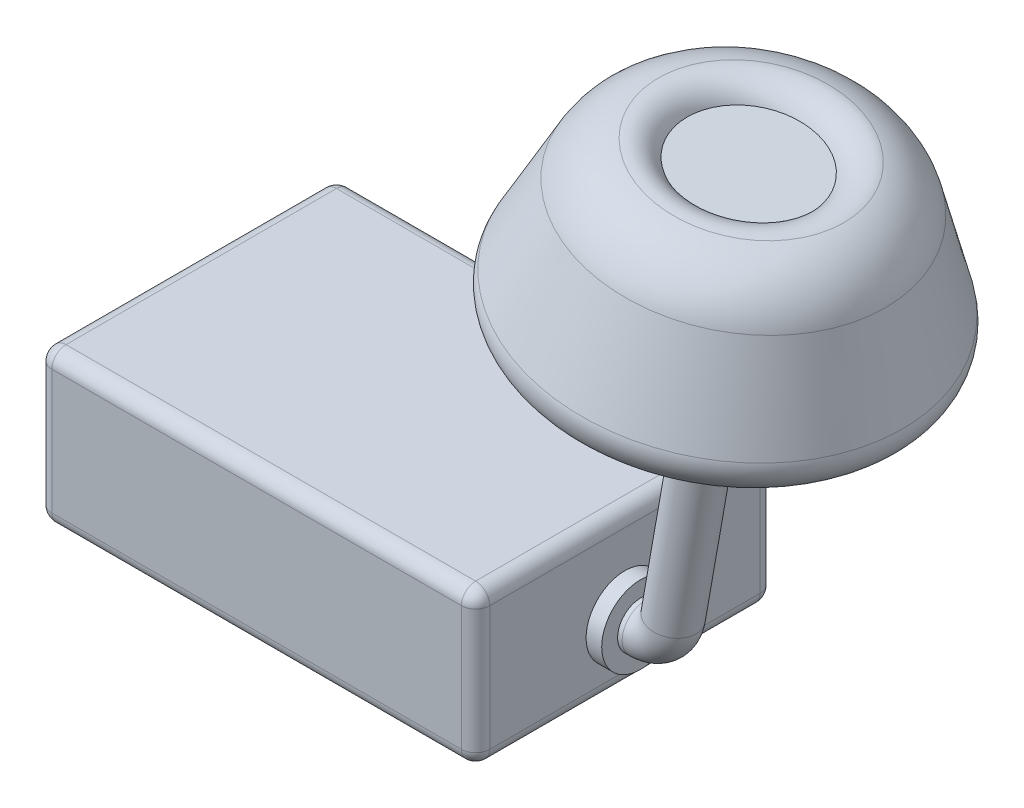
ISO-10303-21;
HEADER;
FILE_DESCRIPTION(('STEP AP214'),'2;1');
FILE_NAME('part.step','',(''),(''),'','','');
FILE_SCHEMA(('AUTOMOTIVE_DESIGN { 1 0 10303 214 1 1 1 1 }'));
ENDSEC;
DATA;
#1=APPLICATION_CONTEXT('core data for automotive mechanical design processes');
#2=APPLICATION_PROTOCOL_DEFINITION('international standard','automotive_design',2000,#1);
#3=PRODUCT_CONTEXT('',#1,'mechanical');
#4=PRODUCT('Part','Part','',(#3));
#5=PRODUCT_RELATED_PRODUCT_CATEGORY('part','',(#4));
#6=PRODUCT_DEFINITION_FORMATION('','',#4);
#7=PRODUCT_DEFINITION_CONTEXT('part definition',#1,'design');
#8=PRODUCT_DEFINITION('design','',#6,#7);
#9=PRODUCT_DEFINITION_SHAPE('','',#8);
#10=(LENGTH_UNIT() NAMED_UNIT(*) SI_UNIT(.MILLI.,.METRE.));
#11=(NAMED_UNIT(*) PLANE_ANGLE_UNIT() SI_UNIT($,.RADIAN.));
#12=(NAMED_UNIT(*) SI_UNIT($,.STERADIAN.) SOLID_ANGLE_UNIT());
#13=UNCERTAINTY_MEASURE_WITH_UNIT(LENGTH_MEASURE(1.E-05),#10,'distance_accuracy_value','');
#14=(GEOMETRIC_REPRESENTATION_CONTEXT(3) GLOBAL_UNCERTAINTY_ASSIGNED_CONTEXT((#13)) GLOBAL_UNIT_ASSIGNED_CONTEXT((#10,
#11,#12)) REPRESENTATION_CONTEXT('',''));
#15=CARTESIAN_POINT('',(0.,0.,0.));
#16=DIRECTION('',(0.,0.,1.));
#17=DIRECTION('',(1.,0.,0.));
#18=AXIS2_PLACEMENT_3D('',#15,#16,#17);
#19=CARTESIAN_POINT('',(19.5834,13.6652,-13.3604));
#20=DIRECTION('',(-1.,0.,0.));
#21=DIRECTION('',(0.,0.,1.));
#22=AXIS2_PLACEMENT_3D('',#19,#20,#21);
#23=PLANE('',#22);
#24=DIRECTION('',(0.,0.,-1.));
#25=VECTOR('',#24,1.);
#26=CARTESIAN_POINT('',(19.5834,1.27,-13.3604));
#27=LINE('',#26,#25);
#28=CARTESIAN_POINT('',(19.5834,1.27,12.0904));
#29=VERTEX_POINT('',#28);
#30=CARTESIAN_POINT('',(19.5834,1.27,-12.0904));
#31=VERTEX_POINT('',#30);
#32=EDGE_CURVE('E209',#29,#31,#27,.T.);
#33=ORIENTED_EDGE('',*,*,#32,.T.);
#34=DIRECTION('',(0.,-1.,0.));
#35=VECTOR('',#34,1.);
#36=CARTESIAN_POINT('',(19.5834,13.6652,-12.0904));
#37=LINE('',#36,#35);
#38=CARTESIAN_POINT('',(19.5834,12.3952,-12.0904));
#39=VERTEX_POINT('',#38);
#40=EDGE_CURVE('E212',#31,#39,#37,.F.);
#41=ORIENTED_EDGE('',*,*,#40,.T.);
#42=DIRECTION('',(0.,0.,-1.));
#43=VECTOR('',#42,1.);
#44=CARTESIAN_POINT('',(19.5834,12.3952,13.3604));
#45=LINE('',#44,#43);
#46=CARTESIAN_POINT('',(19.5834,12.3952,12.0904));
#47=VERTEX_POINT('',#46);
#48=EDGE_CURVE('E207',#39,#47,#45,.F.);
#49=ORIENTED_EDGE('',*,*,#48,.T.);
#50=DIRECTION('',(0.,-1.,0.));
#51=VECTOR('',#50,1.);
#52=CARTESIAN_POINT('',(19.5834,13.6652,12.0904));
#53=LINE('',#52,#51);
#54=EDGE_CURVE('E205',#47,#29,#53,.T.);
#55=ORIENTED_EDGE('',*,*,#54,.T.);
#56=EDGE_LOOP('',(#33,#41,#49,#55));
#57=FACE_BOUND('',#56,.T.);
#58=CARTESIAN_POINT('',(19.5834,5.588,0.));
#59=DIRECTION('',(-1.,0.,0.));
#60=DIRECTION('',(0.,0.,1.));
#61=AXIS2_PLACEMENT_3D('',#58,#59,#60);
#62=CIRCLE('',#61,3.4798);
#63=CARTESIAN_POINT('',(19.5834,5.588,3.4798));
#64=VERTEX_POINT('',#63);
#65=EDGE_CURVE('E312',#64,#64,#62,.F.);
#66=ORIENTED_EDGE('',*,*,#65,.F.);
#67=EDGE_LOOP('',(#66));
#68=FACE_BOUND('',#67,.T.);
#69=ADVANCED_FACE('F38',(#57,#68),#23,.F.);
#70=CARTESIAN_POINT('',(-19.5834,13.6652,-13.3604));
#71=DIRECTION('',(1.,0.,0.));
#72=DIRECTION('',(0.,0.,-1.));
#73=AXIS2_PLACEMENT_3D('',#70,#71,#72);
#74=PLANE('',#73);
#75=DIRECTION('',(0.,0.,1.));
#76=VECTOR('',#75,1.);
#77=CARTESIAN_POINT('',(-19.5834,12.3952,-13.3604));
#78=LINE('',#77,#76);
#79=CARTESIAN_POINT('',(-19.5834,12.3952,12.0904));
#80=VERTEX_POINT('',#79);
#81=CARTESIAN_POINT('',(-19.5834,12.3952,-12.0904));
#82=VERTEX_POINT('',#81);
#83=EDGE_CURVE('E168',#80,#82,#78,.F.);
#84=ORIENTED_EDGE('',*,*,#83,.T.);
#85=DIRECTION('',(0.,-1.,0.));
#86=VECTOR('',#85,1.);
#87=CARTESIAN_POINT('',(-19.5834,13.6652,-12.0904));
#88=LINE('',#87,#86);
#89=CARTESIAN_POINT('',(-19.5834,1.27,-12.0904));
#90=VERTEX_POINT('',#89);
#91=EDGE_CURVE('E173',#82,#90,#88,.T.);
#92=ORIENTED_EDGE('',*,*,#91,.T.);
#93=DIRECTION('',(0.,0.,1.));
#94=VECTOR('',#93,1.);
#95=CARTESIAN_POINT('',(-19.5834,1.27,-13.3604));
#96=LINE('',#95,#94);
#97=CARTESIAN_POINT('',(-19.5834,1.27,12.0904));
#98=VERTEX_POINT('',#97);
#99=EDGE_CURVE('E141',#90,#98,#96,.T.);
#100=ORIENTED_EDGE('',*,*,#99,.T.);
#101=DIRECTION('',(0.,-1.,0.));
#102=VECTOR('',#101,1.);
#103=CARTESIAN_POINT('',(-19.5834,13.6652,12.0904));
#104=LINE('',#103,#102);
#105=EDGE_CURVE('E161',#98,#80,#104,.F.);
#106=ORIENTED_EDGE('',*,*,#105,.T.);
#107=EDGE_LOOP('',(#84,#92,#100,#106));
#108=FACE_BOUND('',#107,.T.);
#109=ADVANCED_FACE('F171',(#108),#74,.F.);
#110=CARTESIAN_POINT('',(-19.5834,13.6652,13.3604));
#111=DIRECTION('',(0.,0.,-1.));
#112=DIRECTION('',(-1.,0.,0.));
#113=AXIS2_PLACEMENT_3D('',#110,#111,#112);
#114=PLANE('',#113);
#115=DIRECTION('',(0.,-1.,0.));
#116=VECTOR('',#115,1.);
#117=CARTESIAN_POINT('',(-18.3134,13.6652,13.3604));
#118=LINE('',#117,#116);
#119=CARTESIAN_POINT('',(-18.3134,12.3952,13.3604));
#120=VERTEX_POINT('',#119);
#121=CARTESIAN_POINT('',(-18.3134,1.27,13.3604));
#122=VERTEX_POINT('',#121);
#123=EDGE_CURVE('E196',#120,#122,#118,.T.);
#124=ORIENTED_EDGE('',*,*,#123,.T.);
#125=DIRECTION('',(1.,0.,0.));
#126=VECTOR('',#125,1.);
#127=CARTESIAN_POINT('',(-19.5834,1.27,13.3604));
#128=LINE('',#127,#126);
#129=CARTESIAN_POINT('',(18.3134,1.27,13.3604));
#130=VERTEX_POINT('',#129);
#131=EDGE_CURVE('E201',#122,#130,#128,.T.);
#132=ORIENTED_EDGE('',*,*,#131,.T.);
#133=DIRECTION('',(0.,-1.,0.));
#134=VECTOR('',#133,1.);
#135=CARTESIAN_POINT('',(18.3134,13.6652,13.3604));
#136=LINE('',#135,#134);
#137=CARTESIAN_POINT('',(18.3134,12.3952,13.3604));
#138=VERTEX_POINT('',#137);
#139=EDGE_CURVE('E199',#130,#138,#136,.F.);
#140=ORIENTED_EDGE('',*,*,#139,.T.);
#141=DIRECTION('',(1.,0.,0.));
#142=VECTOR('',#141,1.);
#143=CARTESIAN_POINT('',(-19.5834,12.3952,13.3604));
#144=LINE('',#143,#142);
#145=EDGE_CURVE('E193',#138,#120,#144,.F.);
#146=ORIENTED_EDGE('',*,*,#145,.T.);
#147=EDGE_LOOP('',(#124,#132,#140,#146));
#148=FACE_BOUND('',#147,.T.);
#149=ADVANCED_FACE('F362',(#148),#114,.F.);
#150=CARTESIAN_POINT('',(-19.5834,13.6652,-13.3604));
#151=DIRECTION('',(0.,0.,1.));
#152=DIRECTION('',(1.,0.,0.));
#153=AXIS2_PLACEMENT_3D('',#150,#151,#152);
#154=PLANE('',#153);
#155=DIRECTION('',(-1.,0.,0.));
#156=VECTOR('',#155,1.);
#157=CARTESIAN_POINT('',(-19.5834,1.27,-13.3604));
#158=LINE('',#157,#156);
#159=CARTESIAN_POINT('',(18.3134,1.27,-13.3604));
#160=VERTEX_POINT('',#159);
#161=CARTESIAN_POINT('',(-18.3134,1.27,-13.3604));
#162=VERTEX_POINT('',#161);
#163=EDGE_CURVE('E218',#160,#162,#158,.T.);
#164=ORIENTED_EDGE('',*,*,#163,.T.);
#165=DIRECTION('',(0.,-1.,0.));
#166=VECTOR('',#165,1.);
#167=CARTESIAN_POINT('',(-18.3134,13.6652,-13.3604));
#168=LINE('',#167,#166);
#169=CARTESIAN_POINT('',(-18.3134,12.3952,-13.3604));
#170=VERTEX_POINT('',#169);
#171=EDGE_CURVE('E222',#162,#170,#168,.F.);
#172=ORIENTED_EDGE('',*,*,#171,.T.);
#173=DIRECTION('',(-1.,0.,0.));
#174=VECTOR('',#173,1.);
#175=CARTESIAN_POINT('',(19.5834,12.3952,-13.3604));
#176=LINE('',#175,#174);
#177=CARTESIAN_POINT('',(18.3134,12.3952,-13.3604));
#178=VERTEX_POINT('',#177);
#179=EDGE_CURVE('E216',#170,#178,#176,.F.);
#180=ORIENTED_EDGE('',*,*,#179,.T.);
#181=DIRECTION('',(0.,-1.,0.));
#182=VECTOR('',#181,1.);
#183=CARTESIAN_POINT('',(18.3134,13.6652,-13.3604));
#184=LINE('',#183,#182);
#185=EDGE_CURVE('E214',#178,#160,#184,.T.);
#186=ORIENTED_EDGE('',*,*,#185,.T.);
#187=EDGE_LOOP('',(#164,#172,#180,#186));
#188=FACE_BOUND('',#187,.T.);
#189=ADVANCED_FACE('F367',(#188),#154,.F.);
#190=CARTESIAN_POINT('',(0.,13.6652,0.));
#191=DIRECTION('',(0.,1.,0.));
#192=DIRECTION('',(0.,0.,1.));
#193=AXIS2_PLACEMENT_3D('',#190,#191,#192);
#194=PLANE('',#193);
#195=DIRECTION('',(0.,0.,-1.));
#196=VECTOR('',#195,1.);
#197=CARTESIAN_POINT('',(18.3134,13.6652,-13.3604));
#198=LINE('',#197,#196);
#199=CARTESIAN_POINT('',(18.3134,13.6652,12.0904));
#200=VERTEX_POINT('',#199);
#201=CARTESIAN_POINT('',(18.3134,13.6652,-12.0904));
#202=VERTEX_POINT('',#201);
#203=EDGE_CURVE('E58',#200,#202,#198,.T.);
#204=ORIENTED_EDGE('',*,*,#203,.T.);
#205=DIRECTION('',(-1.,0.,0.));
#206=VECTOR('',#205,1.);
#207=CARTESIAN_POINT('',(-19.5834,13.6652,-12.0904));
#208=LINE('',#207,#206);
#209=CARTESIAN_POINT('',(-18.3134,13.6652,-12.0904));
#210=VERTEX_POINT('',#209);
#211=EDGE_CURVE('E11',#202,#210,#208,.T.);
#212=ORIENTED_EDGE('',*,*,#211,.T.);
#213=DIRECTION('',(0.,0.,1.));
#214=VECTOR('',#213,1.);
#215=CARTESIAN_POINT('',(-18.3134,13.6652,13.3604));
#216=LINE('',#215,#214);
#217=CARTESIAN_POINT('',(-18.3134,13.6652,12.0904));
#218=VERTEX_POINT('',#217);
#219=EDGE_CURVE('E47',#210,#218,#216,.T.);
#220=ORIENTED_EDGE('',*,*,#219,.T.);
#221=DIRECTION('',(1.,0.,0.));
#222=VECTOR('',#221,1.);
#223=CARTESIAN_POINT('',(19.5834,13.6652,12.0904));
#224=LINE('',#223,#222);
#225=EDGE_CURVE('E224',#218,#200,#224,.T.);
#226=ORIENTED_EDGE('',*,*,#225,.T.);
#227=EDGE_LOOP('',(#204,#212,#220,#226));
#228=FACE_BOUND('',#227,.T.);
#229=ADVANCED_FACE('F426',(#228),#194,.T.);
#230=CARTESIAN_POINT('',(0.,0.,0.));
#231=DIRECTION('',(0.,1.,0.));
#232=DIRECTION('',(0.,0.,1.));
#233=AXIS2_PLACEMENT_3D('',#230,#231,#232);
#234=PLANE('',#233);
#235=DIRECTION('',(1.,0.,0.));
#236=VECTOR('',#235,1.);
#237=CARTESIAN_POINT('',(0.,0.,12.0904));
#238=LINE('',#237,#236);
#239=CARTESIAN_POINT('',(18.3134,0.,12.0904));
#240=VERTEX_POINT('',#239);
#241=CARTESIAN_POINT('',(-18.3134,0.,12.0904));
#242=VERTEX_POINT('',#241);
#243=EDGE_CURVE('E188',#240,#242,#238,.F.);
#244=ORIENTED_EDGE('',*,*,#243,.T.);
#245=DIRECTION('',(0.,0.,1.));
#246=VECTOR('',#245,1.);
#247=CARTESIAN_POINT('',(-18.3134,0.,0.));
#248=LINE('',#247,#246);
#249=CARTESIAN_POINT('',(-18.3134,0.,-12.0904));
#250=VERTEX_POINT('',#249);
#251=EDGE_CURVE('E143',#242,#250,#248,.F.);
#252=ORIENTED_EDGE('',*,*,#251,.T.);
#253=DIRECTION('',(-1.,0.,0.));
#254=VECTOR('',#253,1.);
#255=CARTESIAN_POINT('',(0.,0.,-12.0904));
#256=LINE('',#255,#254);
#257=CARTESIAN_POINT('',(18.3134,0.,-12.0904));
#258=VERTEX_POINT('',#257);
#259=EDGE_CURVE('E179',#250,#258,#256,.F.);
#260=ORIENTED_EDGE('',*,*,#259,.T.);
#261=DIRECTION('',(0.,0.,-1.));
#262=VECTOR('',#261,1.);
#263=CARTESIAN_POINT('',(18.3134,0.,0.));
#264=LINE('',#263,#262);
#265=EDGE_CURVE('E186',#258,#240,#264,.F.);
#266=ORIENTED_EDGE('',*,*,#265,.T.);
#267=EDGE_LOOP('',(#244,#252,#260,#266));
#268=FACE_BOUND('',#267,.T.);
#269=ADVANCED_FACE('F424',(#268),#234,.F.);
#270=CARTESIAN_POINT('',(20.9804,5.588,0.));
#271=DIRECTION('',(-1.,0.,0.));
#272=DIRECTION('',(0.,0.,1.));
#273=AXIS2_PLACEMENT_3D('',#270,#271,#272);
#274=CYLINDRICAL_SURFACE('',#273,3.4798);
#275=CARTESIAN_POINT('',(20.9804,5.588,0.));
#276=DIRECTION('',(1.,0.,0.));
#277=DIRECTION('',(0.,0.,-1.));
#278=AXIS2_PLACEMENT_3D('',#275,#276,#277);
#279=CIRCLE('',#278,3.4798);
#280=CARTESIAN_POINT('',(20.9804,5.588,-3.4798));
#281=VERTEX_POINT('',#280);
#282=EDGE_CURVE('E318',#281,#281,#279,.T.);
#283=ORIENTED_EDGE('',*,*,#282,.F.);
#284=EDGE_LOOP('',(#283));
#285=FACE_BOUND('',#284,.T.);
#286=ORIENTED_EDGE('',*,*,#65,.T.);
#287=EDGE_LOOP('',(#286));
#288=FACE_BOUND('',#287,.T.);
#289=ADVANCED_FACE('F420',(#285,#288),#274,.T.);
#290=CARTESIAN_POINT('',(20.9804,5.588,0.));
#291=DIRECTION('',(1.,0.,0.));
#292=DIRECTION('',(0.,0.,-1.));
#293=AXIS2_PLACEMENT_3D('',#290,#291,#292);
#294=PLANE('',#293);
#295=CARTESIAN_POINT('',(20.9804,5.588,0.));
#296=DIRECTION('',(1.,0.,0.));
#297=DIRECTION('',(0.,0.,-1.));
#298=AXIS2_PLACEMENT_3D('',#295,#296,#297);
#299=CIRCLE('',#298,2.0574);
#300=CARTESIAN_POINT('',(20.9804,3.5306,0.));
#301=VERTEX_POINT('',#300);
#302=EDGE_CURVE('E308',#301,#301,#299,.T.);
#303=ORIENTED_EDGE('',*,*,#302,.F.);
#304=EDGE_LOOP('',(#303));
#305=FACE_BOUND('',#304,.T.);
#306=ORIENTED_EDGE('',*,*,#282,.T.);
#307=EDGE_LOOP('',(#306));
#308=FACE_BOUND('',#307,.T.);
#309=ADVANCED_FACE('F416',(#305,#308),#294,.T.);
#310=CARTESIAN_POINT('',(23.8904986294607,7.686933628726,0.));
#311=DIRECTION('',(0.173648177666927,0.984807753012209,0.));
#312=DIRECTION('',(-0.984807753012209,0.173648177666927,0.));
#313=AXIS2_PLACEMENT_3D('',#310,#311,#312);
#314=CYLINDRICAL_SURFACE('',#313,2.0574);
#315=CARTESIAN_POINT('',(23.8904986294607,7.686933628726,0.));
#316=DIRECTION('',(0.173648177666928,0.984807753012208,0.));
#317=DIRECTION('',(0.,0.,-1.));
#318=AXIS2_PLACEMENT_3D('',#315,#316,#317);
#319=CIRCLE('',#318,2.0574);
#320=CARTESIAN_POINT('',(25.916642100508,7.32966986799406,0.));
#321=VERTEX_POINT('',#320);
#322=EDGE_CURVE('E307',#321,#321,#319,.T.);
#323=ORIENTED_EDGE('',*,*,#322,.T.);
#324=EDGE_LOOP('',(#323));
#325=FACE_BOUND('',#324,.T.);
#326=CARTESIAN_POINT('',(26.607864598918,23.0978818485571,0.));
#327=DIRECTION('',(0.173648177666928,0.984807753012208,0.));
#328=DIRECTION('',(0.,0.,-1.));
#329=AXIS2_PLACEMENT_3D('',#326,#327,#328);
#330=CIRCLE('',#329,2.0574);
#331=CARTESIAN_POINT('',(26.607864598918,23.0978818485571,-2.0574));
#332=VERTEX_POINT('',#331);
#333=EDGE_CURVE('E315',#332,#332,#330,.T.);
#334=ORIENTED_EDGE('',*,*,#333,.F.);
#335=EDGE_LOOP('',(#334));
#336=FACE_BOUND('',#335,.T.);
#337=ADVANCED_FACE('F412',(#325,#336),#314,.T.);
#338=CARTESIAN_POINT('',(21.3890869368097,8.128,0.));
#339=DIRECTION('',(0.,0.,1.));
#340=DIRECTION('',(1.,0.,0.));
#341=AXIS2_PLACEMENT_3D('',#338,#339,#340);
#342=TOROIDAL_SURFACE('',#341,2.54,2.0574);
#343=CARTESIAN_POINT('',(21.3890869368097,5.588,0.));
#344=DIRECTION('',(1.,0.,0.));
#345=DIRECTION('',(0.,0.,-1.));
#346=AXIS2_PLACEMENT_3D('',#343,#344,#345);
#347=CIRCLE('',#346,2.0574);
#348=CARTESIAN_POINT('',(21.3890869368097,3.5306,0.));
#349=VERTEX_POINT('',#348);
#350=EDGE_CURVE('E302',#349,#349,#347,.T.);
#351=CARTESIAN_POINT('',(21.3890869368097,8.128,0.));
#352=DIRECTION('',(0.,0.,1.));
#353=DIRECTION('',(1.,0.,0.));
#354=AXIS2_PLACEMENT_3D('',#351,#352,#353);
#355=CIRCLE('',#354,4.5974);
#356=EDGE_CURVE('',#349,#321,#355,.T.);
#357=ORIENTED_EDGE('',*,*,#350,.T.);
#358=ORIENTED_EDGE('',*,*,#322,.F.);
#359=ORIENTED_EDGE('',*,*,#356,.T.);
#360=ORIENTED_EDGE('',*,*,#356,.F.);
#361=EDGE_LOOP('',(#357,#359,#358,#360));
#362=FACE_BOUND('',#361,.T.);
#363=ADVANCED_FACE('F408',(#362),#342,.T.);
#364=CARTESIAN_POINT('',(21.3890869368097,5.588,0.));
#365=DIRECTION('',(-1.,0.,0.));
#366=DIRECTION('',(0.,-1.,0.));
#367=AXIS2_PLACEMENT_3D('',#364,#365,#366);
#368=CYLINDRICAL_SURFACE('',#367,2.0574);
#369=CARTESIAN_POINT('',(21.3890869368097,3.5306,0.));
#370=CARTESIAN_POINT('',(21.3848297812179,3.5306,0.));
#371=CARTESIAN_POINT('',(21.3805726256262,3.5306,0.));
#372=CARTESIAN_POINT('',(21.3720583144426,3.5306,0.));
#373=CARTESIAN_POINT('',(21.3678011588509,3.5306,0.));
#374=CARTESIAN_POINT('',(21.3592868476673,3.5306,0.));
#375=CARTESIAN_POINT('',(21.3550296920756,3.5306,0.));
#376=CARTESIAN_POINT('',(21.346515380892,3.5306,0.));
#377=CARTESIAN_POINT('',(21.3422582253003,3.5306,0.));
#378=CARTESIAN_POINT('',(21.3337439141167,3.5306,0.));
#379=CARTESIAN_POINT('',(21.329486758525,3.5306,0.));
#380=CARTESIAN_POINT('',(21.3209724473414,3.5306,0.));
#381=CARTESIAN_POINT('',(21.3167152917496,3.5306,0.));
#382=CARTESIAN_POINT('',(21.3082009805661,3.5306,0.));
#383=CARTESIAN_POINT('',(21.3039438249743,3.5306,0.));
#384=CARTESIAN_POINT('',(21.2954295137908,3.5306,0.));
#385=CARTESIAN_POINT('',(21.291172358199,3.5306,0.));
#386=CARTESIAN_POINT('',(21.2826580470155,3.5306,0.));
#387=CARTESIAN_POINT('',(21.2784008914237,3.5306,0.));
#388=CARTESIAN_POINT('',(21.2698865802402,3.5306,0.));
#389=CARTESIAN_POINT('',(21.2656294246484,3.5306,0.));
#390=CARTESIAN_POINT('',(21.2571151134649,3.5306,0.));
#391=CARTESIAN_POINT('',(21.2528579578731,3.5306,0.));
#392=CARTESIAN_POINT('',(21.2443436466896,3.5306,0.));
#393=CARTESIAN_POINT('',(21.2400864910978,3.5306,0.));
#394=CARTESIAN_POINT('',(21.2315721799143,3.5306,0.));
#395=CARTESIAN_POINT('',(21.2273150243225,3.5306,0.));
#396=CARTESIAN_POINT('',(21.218800713139,3.5306,0.));
#397=CARTESIAN_POINT('',(21.2145435575472,3.5306,0.));
#398=CARTESIAN_POINT('',(21.2060292463637,3.5306,0.));
#399=CARTESIAN_POINT('',(21.2017720907719,3.5306,0.));
#400=CARTESIAN_POINT('',(21.1932577795884,3.5306,0.));
#401=CARTESIAN_POINT('',(21.1890006239966,3.5306,0.));
#402=CARTESIAN_POINT('',(21.1804863128131,3.5306,0.));
#403=CARTESIAN_POINT('',(21.1762291572213,3.5306,0.));
#404=CARTESIAN_POINT('',(21.1677148460378,3.5306,0.));
#405=CARTESIAN_POINT('',(21.163457690446,3.5306,0.));
#406=CARTESIAN_POINT('',(21.1549433792625,3.5306,0.));
#407=CARTESIAN_POINT('',(21.1506862236707,3.5306,0.));
#408=CARTESIAN_POINT('',(21.1421719124872,3.5306,0.));
#409=CARTESIAN_POINT('',(21.1379147568954,3.5306,0.));
#410=CARTESIAN_POINT('',(21.1294004457119,3.5306,0.));
#411=CARTESIAN_POINT('',(21.1251432901201,3.5306,0.));
#412=CARTESIAN_POINT('',(21.1166289789366,3.5306,0.));
#413=CARTESIAN_POINT('',(21.1123718233448,3.5306,0.));
#414=CARTESIAN_POINT('',(21.1038575121613,3.5306,0.));
#415=CARTESIAN_POINT('',(21.0996003565695,3.5306,0.));
#416=CARTESIAN_POINT('',(21.091086045386,3.5306,0.));
#417=CARTESIAN_POINT('',(21.0868288897942,3.5306,0.));
#418=CARTESIAN_POINT('',(21.0783145786107,3.5306,0.));
#419=CARTESIAN_POINT('',(21.0740574230189,3.5306,0.));
#420=CARTESIAN_POINT('',(21.0655431118354,3.5306,0.));
#421=CARTESIAN_POINT('',(21.0612859562436,3.5306,0.));
#422=CARTESIAN_POINT('',(21.05277164506,3.5306,0.));
#423=CARTESIAN_POINT('',(21.0485144894683,3.5306,0.));
#424=CARTESIAN_POINT('',(21.0400001782847,3.5306,0.));
#425=CARTESIAN_POINT('',(21.035743022693,3.5306,0.));
#426=CARTESIAN_POINT('',(21.0272287115094,3.5306,0.));
#427=CARTESIAN_POINT('',(21.0229715559177,3.5306,0.));
#428=CARTESIAN_POINT('',(21.0144572447341,3.5306,0.));
#429=CARTESIAN_POINT('',(21.0102000891424,3.5306,0.));
#430=CARTESIAN_POINT('',(21.0016857779588,3.5306,0.));
#431=CARTESIAN_POINT('',(20.9974286223671,3.5306,0.));
#432=CARTESIAN_POINT('',(20.9889143111835,3.5306,0.));
#433=CARTESIAN_POINT('',(20.9846571555918,3.5306,0.));
#434=CARTESIAN_POINT('',(20.9804,3.5306,0.));
#435=B_SPLINE_CURVE_WITH_KNOTS('',3,(#369,#370,#371,#372,#373,#374,#375,#376,#377,#378,#379,
#380,#381,#382,#383,#384,#385,#386,#387,#388,#389,#390,#391,#392,#393,#394,#395,#396,#397,#398,
#399,#400,#401,#402,#403,#404,#405,#406,#407,#408,#409,#410,#411,#412,#413,#414,#415,#416,#417,
#418,#419,#420,#421,#422,#423,#424,#425,#426,#427,#428,#429,#430,#431,#432,#433,#434),
.UNSPECIFIED.,.F.,.F.,(4,2,2,2,2,2,2,2,2,2,2,2,2,2,2,2,2,2,2,2,2,2,2,2,2,2,2,2,2,2,2,2,4),(0.,
0.0127714667753041,0.0255429335506083,0.0383144003259124,0.0510858671012131,0.0638573338765172,
0.0766288006518213,0.0894002674271255,0.102171734202426,0.11494320097773,0.127714667753034,
0.140486134528335,0.153257601303639,0.166029068078943,0.178800534854247,0.191572001629548,
0.204343468404852,0.217114935180156,0.229886401955457,0.242657868730761,0.255429335506065,
0.268200802281369,0.28097226905667,0.293743735831974,0.306515202607278,0.319286669382579,
0.332058136157883,0.344829602933187,0.357601069708491,0.370372536483792,0.383144003259096,
0.3959154700344,0.408686936809701),.UNSPECIFIED.);
#436=EDGE_CURVE('BSEAM404',#349,#301,#435,.T.);
#437=ORIENTED_EDGE('',*,*,#350,.F.);
#438=ORIENTED_EDGE('',*,*,#302,.T.);
#439=ORIENTED_EDGE('',*,*,#436,.T.);
#440=ORIENTED_EDGE('',*,*,#436,.F.);
#441=EDGE_LOOP('',(#437,#439,#438,#440));
#442=FACE_BOUND('',#441,.T.);
#443=ADVANCED_FACE('F404',(#442),#368,.T.);
#444=CARTESIAN_POINT('',(28.151596898377,31.8528227728356,0.));
#445=DIRECTION('',(-0.173648177666928,-0.984807753012209,0.));
#446=DIRECTION('',(0.984807753012208,-0.173648177666928,0.));
#447=AXIS2_PLACEMENT_3D('',#444,#445,#446);
#448=CYLINDRICAL_SURFACE('',#447,3.4036);
#449=CARTESIAN_POINT('',(27.710530527103,29.3514110801846,0.));
#450=DIRECTION('',(0.173648177666928,0.984807753012208,0.));
#451=DIRECTION('',(-0.984807753012208,0.173648177666928,0.));
#452=AXIS2_PLACEMENT_3D('',#449,#450,#451);
#453=CIRCLE('',#452,3.4036);
#454=CARTESIAN_POINT('',(24.3586388589506,29.9424400176918,0.));
#455=VERTEX_POINT('',#454);
#456=EDGE_CURVE('E331',#455,#455,#453,.F.);
#457=ORIENTED_EDGE('',*,*,#456,.T.);
#458=EDGE_LOOP('',(#457));
#459=FACE_BOUND('',#458,.T.);
#460=CARTESIAN_POINT('',(26.607864598918,23.0978818485571,0.));
#461=DIRECTION('',(0.173648177666928,0.984807753012208,0.));
#462=DIRECTION('',(-0.984807753012209,0.173648177666928,0.));
#463=AXIS2_PLACEMENT_3D('',#460,#461,#462);
#464=CIRCLE('',#463,3.4036);
#465=CARTESIAN_POINT('',(23.2559729307656,23.6889107860642,0.));
#466=VERTEX_POINT('',#465);
#467=EDGE_CURVE('E297',#466,#466,#464,.T.);
#468=ORIENTED_EDGE('',*,*,#467,.T.);
#469=EDGE_LOOP('',(#468));
#470=FACE_BOUND('',#469,.T.);
#471=ADVANCED_FACE('F397',(#459,#470),#448,.T.);
#472=CARTESIAN_POINT('',(26.607864598918,23.0978818485571,0.));
#473=DIRECTION('',(0.173648177666928,0.984807753012208,0.));
#474=DIRECTION('',(-0.984807753012209,0.173648177666928,0.));
#475=AXIS2_PLACEMENT_3D('',#472,#473,#474);
#476=PLANE('',#475);
#477=ORIENTED_EDGE('',*,*,#333,.T.);
#478=EDGE_LOOP('',(#477));
#479=FACE_BOUND('',#478,.T.);
#480=ORIENTED_EDGE('',*,*,#467,.F.);
#481=EDGE_LOOP('',(#480));
#482=FACE_BOUND('',#481,.T.);
#483=ADVANCED_FACE('F388',(#479,#482),#476,.F.);
#484=CARTESIAN_POINT('',(28.151596898377,31.8528227728356,0.));
#485=DIRECTION('',(0.173648177666928,0.984807753012208,0.));
#486=DIRECTION('',(-0.984807753012208,0.173648177666928,0.));
#487=AXIS2_PLACEMENT_3D('',#484,#485,#486);
#488=PLANE('',#487);
#489=CARTESIAN_POINT('',(28.151596898377,31.8528227728356,0.));
#490=DIRECTION('',(0.173648177666928,0.984807753012208,0.));
#491=DIRECTION('',(-0.984807753012208,0.173648177666928,0.));
#492=AXIS2_PLACEMENT_3D('',#489,#490,#491);
#493=CIRCLE('',#492,13.517504062875);
#494=CARTESIAN_POINT('',(14.8394540958836,34.2001127199592,0.));
#495=VERTEX_POINT('',#494);
#496=EDGE_CURVE('E328',#495,#495,#493,.F.);
#497=ORIENTED_EDGE('',*,*,#496,.T.);
#498=EDGE_LOOP('',(#497));
#499=FACE_BOUND('',#498,.T.);
#500=CARTESIAN_POINT('',(28.151596898377,31.8528227728356,0.));
#501=DIRECTION('',(0.173648177666928,0.984807753012208,0.));
#502=DIRECTION('',(-0.984807753012208,0.173648177666928,0.));
#503=AXIS2_PLACEMENT_3D('',#500,#501,#502);
#504=CIRCLE('',#503,5.9436);
#505=CARTESIAN_POINT('',(22.2982935375736,32.8849180816168,0.));
#506=VERTEX_POINT('',#505);
#507=EDGE_CURVE('E325',#506,#506,#504,.T.);
#508=ORIENTED_EDGE('',*,*,#507,.T.);
#509=EDGE_LOOP('',(#508));
#510=FACE_BOUND('',#509,.T.);
#511=ADVANCED_FACE('F385',(#499,#510),#488,.F.);
#512=CARTESIAN_POINT('',(28.151596898377,31.8528227728356,0.));
#513=DIRECTION('',(-0.173648177666928,-0.984807753012208,0.));
#514=DIRECTION('',(-0.984807753012208,0.173648177666928,0.));
#515=AXIS2_PLACEMENT_3D('',#512,#513,#514);
#516=CONICAL_SURFACE('',#515,17.145,0.349065850398867);
#517=CARTESIAN_POINT('',(30.1739084220271,43.3219213505164,0.));
#518=DIRECTION('',(-0.173648177666928,-0.984807753012208,0.));
#519=DIRECTION('',(0.984807753012208,-0.173648177666928,0.));
#520=AXIS2_PLACEMENT_3D('',#517,#518,#519);
#521=CIRCLE('',#520,12.9061924932836);
#522=CARTESIAN_POINT('',(42.8840268512808,41.0807845434391,0.));
#523=VERTEX_POINT('',#522);
#524=EDGE_CURVE('E334',#523,#523,#521,.T.);
#525=ORIENTED_EDGE('',*,*,#524,.T.);
#526=EDGE_LOOP('',(#525));
#527=FACE_BOUND('',#526,.T.);
#528=CARTESIAN_POINT('',(28.7435168531702,35.2097676511236,0.));
#529=DIRECTION('',(0.173648177666928,0.984807753012208,0.));
#530=DIRECTION('',(-0.984807753012208,0.173648177666928,0.));
#531=AXIS2_PLACEMENT_3D('',#528,#529,#530);
#532=CIRCLE('',#531,15.9043233196712);
#533=CARTESIAN_POINT('',(13.0808159415451,37.9715244126102,0.));
#534=VERTEX_POINT('',#533);
#535=EDGE_CURVE('E311',#534,#534,#532,.T.);
#536=ORIENTED_EDGE('',*,*,#535,.T.);
#537=EDGE_LOOP('',(#536));
#538=FACE_BOUND('',#537,.T.);
#539=ADVANCED_FACE('F387',(#527,#538),#516,.T.);
#540=CARTESIAN_POINT('',(30.6480325597878,46.0108129532403,0.));
#541=DIRECTION('',(0.173648177666928,0.984807753012209,0.));
#542=DIRECTION('',(-0.984807753012209,0.173648177666928,0.));
#543=AXIS2_PLACEMENT_3D('',#540,#541,#542);
#544=PLANE('',#543);
#545=CARTESIAN_POINT('',(30.6480325597878,46.0108129532403,0.));
#546=DIRECTION('',(0.173648177666928,0.984807753012209,0.));
#547=DIRECTION('',(-0.984807753012209,0.173648177666928,0.));
#548=AXIS2_PLACEMENT_3D('',#545,#546,#547);
#549=CIRCLE('',#548,5.588);
#550=CARTESIAN_POINT('',(25.1449268359556,46.9811589700431,0.));
#551=VERTEX_POINT('',#550);
#552=EDGE_CURVE('E292',#551,#551,#549,.T.);
#553=ORIENTED_EDGE('',*,*,#552,.T.);
#554=EDGE_LOOP('',(#553));
#555=FACE_BOUND('',#554,.T.);
#556=ADVANCED_FACE('F375',(#555),#544,.T.);
#557=CARTESIAN_POINT('',(28.592663269651,34.3542344654866,0.));
#558=DIRECTION('',(0.173648177666928,0.984807753012208,0.));
#559=DIRECTION('',(-0.984807753012208,0.173648177666928,0.));
#560=AXIS2_PLACEMENT_3D('',#557,#558,#559);
#561=TOROIDAL_SURFACE('',#560,13.517504062875,2.54);
#562=ORIENTED_EDGE('',*,*,#496,.F.);
#563=EDGE_LOOP('',(#562));
#564=FACE_BOUND('',#563,.T.);
#565=ORIENTED_EDGE('',*,*,#535,.F.);
#566=EDGE_LOOP('',(#565));
#567=FACE_BOUND('',#566,.T.);
#568=ADVANCED_FACE('F372',(#564,#567),#561,.T.);
#569=CARTESIAN_POINT('',(27.710530527103,29.3514110801846,0.));
#570=DIRECTION('',(0.173648177666928,0.984807753012208,0.));
#571=DIRECTION('',(-0.984807753012208,0.173648177666928,0.));
#572=AXIS2_PLACEMENT_3D('',#569,#570,#571);
#573=TOROIDAL_SURFACE('',#572,5.9436,2.54);
#574=ORIENTED_EDGE('',*,*,#456,.F.);
#575=EDGE_LOOP('',(#574));
#576=FACE_BOUND('',#575,.T.);
#577=ORIENTED_EDGE('',*,*,#507,.F.);
#578=EDGE_LOOP('',(#577));
#579=FACE_BOUND('',#578,.T.);
#580=ADVANCED_FACE('F353',(#576,#579),#573,.F.);
#581=CARTESIAN_POINT('',(29.796774463229,41.1830883864239,0.));
#582=DIRECTION('',(0.173648177666928,0.984807753012208,0.));
#583=DIRECTION('',(-0.984807753012208,0.173648177666928,0.));
#584=AXIS2_PLACEMENT_3D('',#581,#582,#583);
#585=TOROIDAL_SURFACE('',#584,6.9391443512931,6.35);
#586=CARTESIAN_POINT('',(30.8690079266721,47.2640265340346,0.));
#587=DIRECTION('',(-0.173648177666926,-0.984807753012209,0.));
#588=DIRECTION('',(0.984807753012209,-0.173648177666926,0.));
#589=AXIS2_PLACEMENT_3D('',#586,#587,#588);
#590=CIRCLE('',#589,8.42069983280775);
#591=CARTESIAN_POINT('',(39.1617784078098,45.8017873533873,0.));
#592=VERTEX_POINT('',#591);
#593=EDGE_CURVE('E169',#592,#592,#590,.T.);
#594=ORIENTED_EDGE('',*,*,#593,.T.);
#595=EDGE_LOOP('',(#594));
#596=FACE_BOUND('',#595,.T.);
#597=ORIENTED_EDGE('',*,*,#524,.F.);
#598=EDGE_LOOP('',(#597));
#599=FACE_BOUND('',#598,.T.);
#600=ADVANCED_FACE('F340',(#596,#599),#585,.T.);
#601=CARTESIAN_POINT('',(30.4401145412948,44.8316512749903,0.));
#602=DIRECTION('',(-0.173648177666926,-0.984807753012209,0.));
#603=DIRECTION('',(0.984807753012209,-0.173648177666926,0.));
#604=AXIS2_PLACEMENT_3D('',#601,#602,#603);
#605=TOROIDAL_SURFACE('',#604,7.82807764020189,2.54);
#606=ORIENTED_EDGE('',*,*,#593,.F.);
#607=EDGE_LOOP('',(#606));
#608=FACE_BOUND('',#607,.T.);
#609=ORIENTED_EDGE('',*,*,#552,.F.);
#610=EDGE_LOOP('',(#609));
#611=FACE_BOUND('',#610,.T.);
#612=ADVANCED_FACE('F343',(#608,#611),#605,.T.);
#613=CARTESIAN_POINT('',(18.3134,12.3952,0.));
#614=DIRECTION('',(0.,0.,1.));
#615=DIRECTION('',(1.,0.,0.));
#616=AXIS2_PLACEMENT_3D('',#613,#614,#615);
#617=CYLINDRICAL_SURFACE('',#616,1.27);
#618=CARTESIAN_POINT('',(18.3134,12.3952,-12.0904));
#619=DIRECTION('',(0.,0.,-1.));
#620=DIRECTION('',(-1.,0.,0.));
#621=AXIS2_PLACEMENT_3D('',#618,#619,#620);
#622=CIRCLE('',#621,1.27);
#623=EDGE_CURVE('E42',#202,#39,#622,.T.);
#624=ORIENTED_EDGE('',*,*,#623,.F.);
#625=ORIENTED_EDGE('',*,*,#203,.F.);
#626=CARTESIAN_POINT('',(18.3134,12.3952,12.0904));
#627=DIRECTION('',(0.,0.,1.));
#628=DIRECTION('',(0.,-1.,0.));
#629=AXIS2_PLACEMENT_3D('',#626,#627,#628);
#630=CIRCLE('',#629,1.27);
#631=EDGE_CURVE('E285',#47,#200,#630,.T.);
#632=ORIENTED_EDGE('',*,*,#631,.F.);
#633=ORIENTED_EDGE('',*,*,#48,.F.);
#634=EDGE_LOOP('',(#624,#625,#632,#633));
#635=FACE_BOUND('',#634,.T.);
#636=ADVANCED_FACE('F40',(#635),#617,.T.);
#637=CARTESIAN_POINT('',(18.3134,12.3952,-12.0904));
#638=DIRECTION('',(0.,0.,1.));
#639=DIRECTION('',(1.,0.,0.));
#640=AXIS2_PLACEMENT_3D('',#637,#638,#639);
#641=SPHERICAL_SURFACE('',#640,1.27);
#642=CARTESIAN_POINT('',(18.3134,12.3952,-12.0904));
#643=DIRECTION('',(1.,0.,0.));
#644=DIRECTION('',(0.,0.,-1.));
#645=AXIS2_PLACEMENT_3D('',#642,#643,#644);
#646=CIRCLE('',#645,1.27);
#647=EDGE_CURVE('E280',#202,#178,#646,.F.);
#648=ORIENTED_EDGE('',*,*,#647,.F.);
#649=ORIENTED_EDGE('',*,*,#623,.T.);
#650=CARTESIAN_POINT('',(18.3134,12.3952,-12.0904));
#651=DIRECTION('',(0.,1.,0.));
#652=DIRECTION('',(0.,0.,1.));
#653=AXIS2_PLACEMENT_3D('',#650,#651,#652);
#654=CIRCLE('',#653,1.27);
#655=EDGE_CURVE('E283',#178,#39,#654,.F.);
#656=ORIENTED_EDGE('',*,*,#655,.F.);
#657=EDGE_LOOP('',(#648,#649,#656));
#658=FACE_BOUND('',#657,.T.);
#659=ADVANCED_FACE('F351',(#658),#641,.T.);
#660=CARTESIAN_POINT('',(18.3134,12.3952,12.0904));
#661=DIRECTION('',(0.,0.,1.));
#662=DIRECTION('',(1.,0.,0.));
#663=AXIS2_PLACEMENT_3D('',#660,#661,#662);
#664=SPHERICAL_SURFACE('',#663,1.27);
#665=CARTESIAN_POINT('',(18.3134,12.3952,12.0904));
#666=DIRECTION('',(0.,1.,0.));
#667=DIRECTION('',(0.,0.,1.));
#668=AXIS2_PLACEMENT_3D('',#665,#666,#667);
#669=CIRCLE('',#668,1.27);
#670=EDGE_CURVE('E274',#47,#138,#669,.F.);
#671=ORIENTED_EDGE('',*,*,#670,.F.);
#672=ORIENTED_EDGE('',*,*,#631,.T.);
#673=CARTESIAN_POINT('',(18.3134,12.3952,12.0904));
#674=DIRECTION('',(1.,0.,0.));
#675=DIRECTION('',(0.,0.,-1.));
#676=AXIS2_PLACEMENT_3D('',#673,#674,#675);
#677=CIRCLE('',#676,1.27);
#678=EDGE_CURVE('E277',#138,#200,#677,.F.);
#679=ORIENTED_EDGE('',*,*,#678,.F.);
#680=EDGE_LOOP('',(#671,#672,#679));
#681=FACE_BOUND('',#680,.T.);
#682=ADVANCED_FACE('F513',(#681),#664,.T.);
#683=CARTESIAN_POINT('',(18.3134,13.6652,-12.0904));
#684=DIRECTION('',(0.,-1.,0.));
#685=DIRECTION('',(0.,0.,-1.));
#686=AXIS2_PLACEMENT_3D('',#683,#684,#685);
#687=CYLINDRICAL_SURFACE('',#686,1.27);
#688=ORIENTED_EDGE('',*,*,#655,.T.);
#689=ORIENTED_EDGE('',*,*,#40,.F.);
#690=CARTESIAN_POINT('',(18.3134,1.27,-12.0904));
#691=DIRECTION('',(0.,-1.,0.));
#692=DIRECTION('',(0.,0.,-1.));
#693=AXIS2_PLACEMENT_3D('',#690,#691,#692);
#694=CIRCLE('',#693,1.27);
#695=EDGE_CURVE('E269',#160,#31,#694,.T.);
#696=ORIENTED_EDGE('',*,*,#695,.F.);
#697=ORIENTED_EDGE('',*,*,#185,.F.);
#698=EDGE_LOOP('',(#688,#689,#696,#697));
#699=FACE_BOUND('',#698,.T.);
#700=ADVANCED_FACE('F477',(#699),#687,.T.);
#701=CARTESIAN_POINT('',(0.,12.3952,-12.0904));
#702=DIRECTION('',(1.,0.,0.));
#703=DIRECTION('',(0.,0.,-1.));
#704=AXIS2_PLACEMENT_3D('',#701,#702,#703);
#705=CYLINDRICAL_SURFACE('',#704,1.27);
#706=ORIENTED_EDGE('',*,*,#647,.T.);
#707=ORIENTED_EDGE('',*,*,#179,.F.);
#708=CARTESIAN_POINT('',(-18.3134,12.3952,-12.0904));
#709=DIRECTION('',(-1.,0.,0.));
#710=DIRECTION('',(0.,0.,1.));
#711=AXIS2_PLACEMENT_3D('',#708,#709,#710);
#712=CIRCLE('',#711,1.27);
#713=EDGE_CURVE('E266',#210,#170,#712,.T.);
#714=ORIENTED_EDGE('',*,*,#713,.F.);
#715=ORIENTED_EDGE('',*,*,#211,.F.);
#716=EDGE_LOOP('',(#706,#707,#714,#715));
#717=FACE_BOUND('',#716,.T.);
#718=ADVANCED_FACE('F507',(#717),#705,.T.);
#719=CARTESIAN_POINT('',(-18.3134,12.3952,0.));
#720=DIRECTION('',(0.,0.,-1.));
#721=DIRECTION('',(-1.,0.,0.));
#722=AXIS2_PLACEMENT_3D('',#719,#720,#721);
#723=CYLINDRICAL_SURFACE('',#722,1.27);
#724=CARTESIAN_POINT('',(-18.3134,12.3952,12.0904));
#725=DIRECTION('',(0.,0.,1.));
#726=DIRECTION('',(1.,0.,0.));
#727=AXIS2_PLACEMENT_3D('',#724,#725,#726);
#728=CIRCLE('',#727,1.27);
#729=EDGE_CURVE('E259',#218,#80,#728,.T.);
#730=ORIENTED_EDGE('',*,*,#729,.F.);
#731=ORIENTED_EDGE('',*,*,#219,.F.);
#732=CARTESIAN_POINT('',(-18.3134,12.3952,-12.0904));
#733=DIRECTION('',(0.,0.,-1.));
#734=DIRECTION('',(-1.,0.,0.));
#735=AXIS2_PLACEMENT_3D('',#732,#733,#734);
#736=CIRCLE('',#735,1.27);
#737=EDGE_CURVE('E263',#82,#210,#736,.T.);
#738=ORIENTED_EDGE('',*,*,#737,.F.);
#739=ORIENTED_EDGE('',*,*,#83,.F.);
#740=EDGE_LOOP('',(#730,#731,#738,#739));
#741=FACE_BOUND('',#740,.T.);
#742=ADVANCED_FACE('F449',(#741),#723,.T.);
#743=CARTESIAN_POINT('',(0.,12.3952,12.0904));
#744=DIRECTION('',(-1.,0.,0.));
#745=DIRECTION('',(0.,0.,1.));
#746=AXIS2_PLACEMENT_3D('',#743,#744,#745);
#747=CYLINDRICAL_SURFACE('',#746,1.27);
#748=ORIENTED_EDGE('',*,*,#678,.T.);
#749=ORIENTED_EDGE('',*,*,#225,.F.);
#750=CARTESIAN_POINT('',(-18.3134,12.3952,12.0904));
#751=DIRECTION('',(-1.,0.,0.));
#752=DIRECTION('',(0.,0.,1.));
#753=AXIS2_PLACEMENT_3D('',#750,#751,#752);
#754=CIRCLE('',#753,1.27);
#755=EDGE_CURVE('E256',#120,#218,#754,.T.);
#756=ORIENTED_EDGE('',*,*,#755,.F.);
#757=ORIENTED_EDGE('',*,*,#145,.F.);
#758=EDGE_LOOP('',(#748,#749,#756,#757));
#759=FACE_BOUND('',#758,.T.);
#760=ADVANCED_FACE('F444',(#759),#747,.T.);
#761=CARTESIAN_POINT('',(18.3134,13.6652,12.0904));
#762=DIRECTION('',(0.,-1.,0.));
#763=DIRECTION('',(0.,0.,-1.));
#764=AXIS2_PLACEMENT_3D('',#761,#762,#763);
#765=CYLINDRICAL_SURFACE('',#764,1.27);
#766=ORIENTED_EDGE('',*,*,#670,.T.);
#767=ORIENTED_EDGE('',*,*,#139,.F.);
#768=CARTESIAN_POINT('',(18.3134,1.27,12.0904));
#769=DIRECTION('',(0.,-1.,0.));
#770=DIRECTION('',(0.,0.,-1.));
#771=AXIS2_PLACEMENT_3D('',#768,#769,#770);
#772=CIRCLE('',#771,1.27);
#773=EDGE_CURVE('E253',#29,#130,#772,.T.);
#774=ORIENTED_EDGE('',*,*,#773,.F.);
#775=ORIENTED_EDGE('',*,*,#54,.F.);
#776=EDGE_LOOP('',(#766,#767,#774,#775));
#777=FACE_BOUND('',#776,.T.);
#778=ADVANCED_FACE('F482',(#777),#765,.T.);
#779=CARTESIAN_POINT('',(18.3134,1.27,-13.3604));
#780=DIRECTION('',(0.,0.,-1.));
#781=DIRECTION('',(-1.,0.,0.));
#782=AXIS2_PLACEMENT_3D('',#779,#780,#781);
#783=CYLINDRICAL_SURFACE('',#782,1.27);
#784=CARTESIAN_POINT('',(18.3134,1.27,-12.0904));
#785=DIRECTION('',(0.,0.,-1.));
#786=DIRECTION('',(-1.,0.,0.));
#787=AXIS2_PLACEMENT_3D('',#784,#785,#786);
#788=CIRCLE('',#787,1.27);
#789=EDGE_CURVE('E271',#31,#258,#788,.T.);
#790=ORIENTED_EDGE('',*,*,#789,.F.);
#791=ORIENTED_EDGE('',*,*,#32,.F.);
#792=CARTESIAN_POINT('',(18.3134,1.27,12.0904));
#793=DIRECTION('',(0.,0.,1.));
#794=DIRECTION('',(1.,0.,0.));
#795=AXIS2_PLACEMENT_3D('',#792,#793,#794);
#796=CIRCLE('',#795,1.27);
#797=EDGE_CURVE('E250',#240,#29,#796,.T.);
#798=ORIENTED_EDGE('',*,*,#797,.F.);
#799=ORIENTED_EDGE('',*,*,#265,.F.);
#800=EDGE_LOOP('',(#790,#791,#798,#799));
#801=FACE_BOUND('',#800,.T.);
#802=ADVANCED_FACE('F469',(#801),#783,.T.);
#803=CARTESIAN_POINT('',(18.3134,1.27,-12.0904));
#804=DIRECTION('',(0.,0.,1.));
#805=DIRECTION('',(1.,0.,0.));
#806=AXIS2_PLACEMENT_3D('',#803,#804,#805);
#807=SPHERICAL_SURFACE('',#806,1.27);
#808=ORIENTED_EDGE('',*,*,#695,.T.);
#809=ORIENTED_EDGE('',*,*,#789,.T.);
#810=CARTESIAN_POINT('',(18.3134,1.27,-12.0904));
#811=DIRECTION('',(1.,0.,0.));
#812=DIRECTION('',(0.,0.,-1.));
#813=AXIS2_PLACEMENT_3D('',#810,#811,#812);
#814=CIRCLE('',#813,1.27);
#815=EDGE_CURVE('E247',#160,#258,#814,.F.);
#816=ORIENTED_EDGE('',*,*,#815,.F.);
#817=EDGE_LOOP('',(#808,#809,#816));
#818=FACE_BOUND('',#817,.T.);
#819=ADVANCED_FACE('F473',(#818),#807,.T.);
#820=CARTESIAN_POINT('',(-18.3134,12.3952,-12.0904));
#821=DIRECTION('',(0.,0.,1.));
#822=DIRECTION('',(1.,0.,0.));
#823=AXIS2_PLACEMENT_3D('',#820,#821,#822);
#824=SPHERICAL_SURFACE('',#823,1.27);
#825=ORIENTED_EDGE('',*,*,#737,.T.);
#826=ORIENTED_EDGE('',*,*,#713,.T.);
#827=CARTESIAN_POINT('',(-18.3134,12.3952,-12.0904));
#828=DIRECTION('',(0.,1.,0.));
#829=DIRECTION('',(0.,0.,1.));
#830=AXIS2_PLACEMENT_3D('',#827,#828,#829);
#831=CIRCLE('',#830,1.27);
#832=EDGE_CURVE('E244',#82,#170,#831,.F.);
#833=ORIENTED_EDGE('',*,*,#832,.F.);
#834=EDGE_LOOP('',(#825,#826,#833));
#835=FACE_BOUND('',#834,.T.);
#836=ADVANCED_FACE('F454',(#835),#824,.T.);
#837=CARTESIAN_POINT('',(-18.3134,12.3952,12.0904));
#838=DIRECTION('',(0.,0.,1.));
#839=DIRECTION('',(1.,0.,0.));
#840=AXIS2_PLACEMENT_3D('',#837,#838,#839);
#841=SPHERICAL_SURFACE('',#840,1.27);
#842=ORIENTED_EDGE('',*,*,#755,.T.);
#843=ORIENTED_EDGE('',*,*,#729,.T.);
#844=CARTESIAN_POINT('',(-18.3134,12.3952,12.0904));
#845=DIRECTION('',(0.,1.,0.));
#846=DIRECTION('',(0.,0.,1.));
#847=AXIS2_PLACEMENT_3D('',#844,#845,#846);
#848=CIRCLE('',#847,1.27);
#849=EDGE_CURVE('E164',#120,#80,#848,.F.);
#850=ORIENTED_EDGE('',*,*,#849,.F.);
#851=EDGE_LOOP('',(#842,#843,#850));
#852=FACE_BOUND('',#851,.T.);
#853=ADVANCED_FACE('F447',(#852),#841,.T.);
#854=CARTESIAN_POINT('',(18.3134,1.27,12.0904));
#855=DIRECTION('',(0.,0.,1.));
#856=DIRECTION('',(1.,0.,0.));
#857=AXIS2_PLACEMENT_3D('',#854,#855,#856);
#858=SPHERICAL_SURFACE('',#857,1.27);
#859=ORIENTED_EDGE('',*,*,#797,.T.);
#860=ORIENTED_EDGE('',*,*,#773,.T.);
#861=CARTESIAN_POINT('',(18.3134,1.27,12.0904));
#862=DIRECTION('',(1.,0.,0.));
#863=DIRECTION('',(0.,0.,-1.));
#864=AXIS2_PLACEMENT_3D('',#861,#862,#863);
#865=CIRCLE('',#864,1.27);
#866=EDGE_CURVE('E240',#240,#130,#865,.F.);
#867=ORIENTED_EDGE('',*,*,#866,.F.);
#868=EDGE_LOOP('',(#859,#860,#867));
#869=FACE_BOUND('',#868,.T.);
#870=ADVANCED_FACE('F484',(#869),#858,.T.);
#871=CARTESIAN_POINT('',(-19.5834,1.27,-12.0904));
#872=DIRECTION('',(-1.,0.,0.));
#873=DIRECTION('',(0.,0.,1.));
#874=AXIS2_PLACEMENT_3D('',#871,#872,#873);
#875=CYLINDRICAL_SURFACE('',#874,1.27);
#876=ORIENTED_EDGE('',*,*,#815,.T.);
#877=ORIENTED_EDGE('',*,*,#259,.F.);
#878=CARTESIAN_POINT('',(-18.3134,1.27,-12.0904));
#879=DIRECTION('',(-1.,0.,0.));
#880=DIRECTION('',(0.,0.,1.));
#881=AXIS2_PLACEMENT_3D('',#878,#879,#880);
#882=CIRCLE('',#881,1.27);
#883=EDGE_CURVE('E236',#162,#250,#882,.T.);
#884=ORIENTED_EDGE('',*,*,#883,.F.);
#885=ORIENTED_EDGE('',*,*,#163,.F.);
#886=EDGE_LOOP('',(#876,#877,#884,#885));
#887=FACE_BOUND('',#886,.T.);
#888=ADVANCED_FACE('F465',(#887),#875,.T.);
#889=CARTESIAN_POINT('',(-18.3134,13.6652,-12.0904));
#890=DIRECTION('',(0.,-1.,0.));
#891=DIRECTION('',(0.,0.,-1.));
#892=AXIS2_PLACEMENT_3D('',#889,#890,#891);
#893=CYLINDRICAL_SURFACE('',#892,1.27);
#894=ORIENTED_EDGE('',*,*,#832,.T.);
#895=ORIENTED_EDGE('',*,*,#171,.F.);
#896=CARTESIAN_POINT('',(-18.3134,1.27,-12.0904));
#897=DIRECTION('',(0.,-1.,0.));
#898=DIRECTION('',(0.,0.,-1.));
#899=AXIS2_PLACEMENT_3D('',#896,#897,#898);
#900=CIRCLE('',#899,1.27);
#901=EDGE_CURVE('E158',#90,#162,#900,.T.);
#902=ORIENTED_EDGE('',*,*,#901,.F.);
#903=ORIENTED_EDGE('',*,*,#91,.F.);
#904=EDGE_LOOP('',(#894,#895,#902,#903));
#905=FACE_BOUND('',#904,.T.);
#906=ADVANCED_FACE('F457',(#905),#893,.T.);
#907=CARTESIAN_POINT('',(-18.3134,13.6652,12.0904));
#908=DIRECTION('',(0.,-1.,0.));
#909=DIRECTION('',(0.,0.,-1.));
#910=AXIS2_PLACEMENT_3D('',#907,#908,#909);
#911=CYLINDRICAL_SURFACE('',#910,1.27);
#912=ORIENTED_EDGE('',*,*,#849,.T.);
#913=ORIENTED_EDGE('',*,*,#105,.F.);
#914=CARTESIAN_POINT('',(-18.3134,1.27,12.0904));
#915=DIRECTION('',(0.,-1.,0.));
#916=DIRECTION('',(0.,0.,-1.));
#917=AXIS2_PLACEMENT_3D('',#914,#915,#916);
#918=CIRCLE('',#917,1.27);
#919=EDGE_CURVE('E150',#122,#98,#918,.T.);
#920=ORIENTED_EDGE('',*,*,#919,.F.);
#921=ORIENTED_EDGE('',*,*,#123,.F.);
#922=EDGE_LOOP('',(#912,#913,#920,#921));
#923=FACE_BOUND('',#922,.T.);
#924=ADVANCED_FACE('F162',(#923),#911,.T.);
#925=CARTESIAN_POINT('',(-19.5834,1.27,12.0904));
#926=DIRECTION('',(1.,0.,0.));
#927=DIRECTION('',(0.,0.,-1.));
#928=AXIS2_PLACEMENT_3D('',#925,#926,#927);
#929=CYLINDRICAL_SURFACE('',#928,1.27);
#930=ORIENTED_EDGE('',*,*,#866,.T.);
#931=ORIENTED_EDGE('',*,*,#131,.F.);
#932=CARTESIAN_POINT('',(-18.3134,1.27,12.0904));
#933=DIRECTION('',(-1.,0.,0.));
#934=DIRECTION('',(0.,0.,1.));
#935=AXIS2_PLACEMENT_3D('',#932,#933,#934);
#936=CIRCLE('',#935,1.27);
#937=EDGE_CURVE('E154',#242,#122,#936,.T.);
#938=ORIENTED_EDGE('',*,*,#937,.F.);
#939=ORIENTED_EDGE('',*,*,#243,.F.);
#940=EDGE_LOOP('',(#930,#931,#938,#939));
#941=FACE_BOUND('',#940,.T.);
#942=ADVANCED_FACE('F437',(#941),#929,.T.);
#943=CARTESIAN_POINT('',(-18.3134,1.27,-12.0904));
#944=DIRECTION('',(0.,0.,1.));
#945=DIRECTION('',(1.,0.,0.));
#946=AXIS2_PLACEMENT_3D('',#943,#944,#945);
#947=SPHERICAL_SURFACE('',#946,1.27);
#948=ORIENTED_EDGE('',*,*,#901,.T.);
#949=ORIENTED_EDGE('',*,*,#883,.T.);
#950=CARTESIAN_POINT('',(-18.3134,1.27,-12.0904));
#951=DIRECTION('',(0.,0.,-1.));
#952=DIRECTION('',(-1.,0.,0.));
#953=AXIS2_PLACEMENT_3D('',#950,#951,#952);
#954=CIRCLE('',#953,1.27);
#955=EDGE_CURVE('E147',#90,#250,#954,.F.);
#956=ORIENTED_EDGE('',*,*,#955,.F.);
#957=EDGE_LOOP('',(#948,#949,#956));
#958=FACE_BOUND('',#957,.T.);
#959=ADVANCED_FACE('F461',(#958),#947,.T.);
#960=CARTESIAN_POINT('',(-18.3134,1.27,12.0904));
#961=DIRECTION('',(0.,0.,1.));
#962=DIRECTION('',(1.,0.,0.));
#963=AXIS2_PLACEMENT_3D('',#960,#961,#962);
#964=SPHERICAL_SURFACE('',#963,1.27);
#965=ORIENTED_EDGE('',*,*,#937,.T.);
#966=ORIENTED_EDGE('',*,*,#919,.T.);
#967=CARTESIAN_POINT('',(-18.3134,1.27,12.0904));
#968=DIRECTION('',(0.,0.,1.));
#969=DIRECTION('',(1.,0.,0.));
#970=AXIS2_PLACEMENT_3D('',#967,#968,#969);
#971=CIRCLE('',#970,1.27);
#972=EDGE_CURVE('E137',#242,#98,#971,.F.);
#973=ORIENTED_EDGE('',*,*,#972,.F.);
#974=EDGE_LOOP('',(#965,#966,#973));
#975=FACE_BOUND('',#974,.T.);
#976=ADVANCED_FACE('F152',(#975),#964,.T.);
#977=CARTESIAN_POINT('',(-18.3134,1.27,-13.3604));
#978=DIRECTION('',(0.,0.,1.));
#979=DIRECTION('',(1.,0.,0.));
#980=AXIS2_PLACEMENT_3D('',#977,#978,#979);
#981=CYLINDRICAL_SURFACE('',#980,1.27);
#982=ORIENTED_EDGE('',*,*,#955,.T.);
#983=ORIENTED_EDGE('',*,*,#251,.F.);
#984=ORIENTED_EDGE('',*,*,#972,.T.);
#985=ORIENTED_EDGE('',*,*,#99,.F.);
#986=EDGE_LOOP('',(#982,#983,#984,#985));
#987=FACE_BOUND('',#986,.T.);
#988=ADVANCED_FACE('F139',(#987),#981,.T.);
#989=CLOSED_SHELL('',(#69,#109,#149,#189,#229,#269,#289,#309,#337,#363,#443,#471,#483,#511,#539,
#556,#568,#580,#600,#612,#636,#659,#682,#700,#718,#742,#760,#778,#802,#819,#836,#853,#870,#888,
#906,#924,#942,#959,#976,#988));
#990=MANIFOLD_SOLID_BREP('B2',#989);
#991=ADVANCED_BREP_SHAPE_REPRESENTATION('',(#18,#990),#14);
#992=SHAPE_DEFINITION_REPRESENTATION(#9,#991);
ENDSEC;
END-ISO-10303-21;
